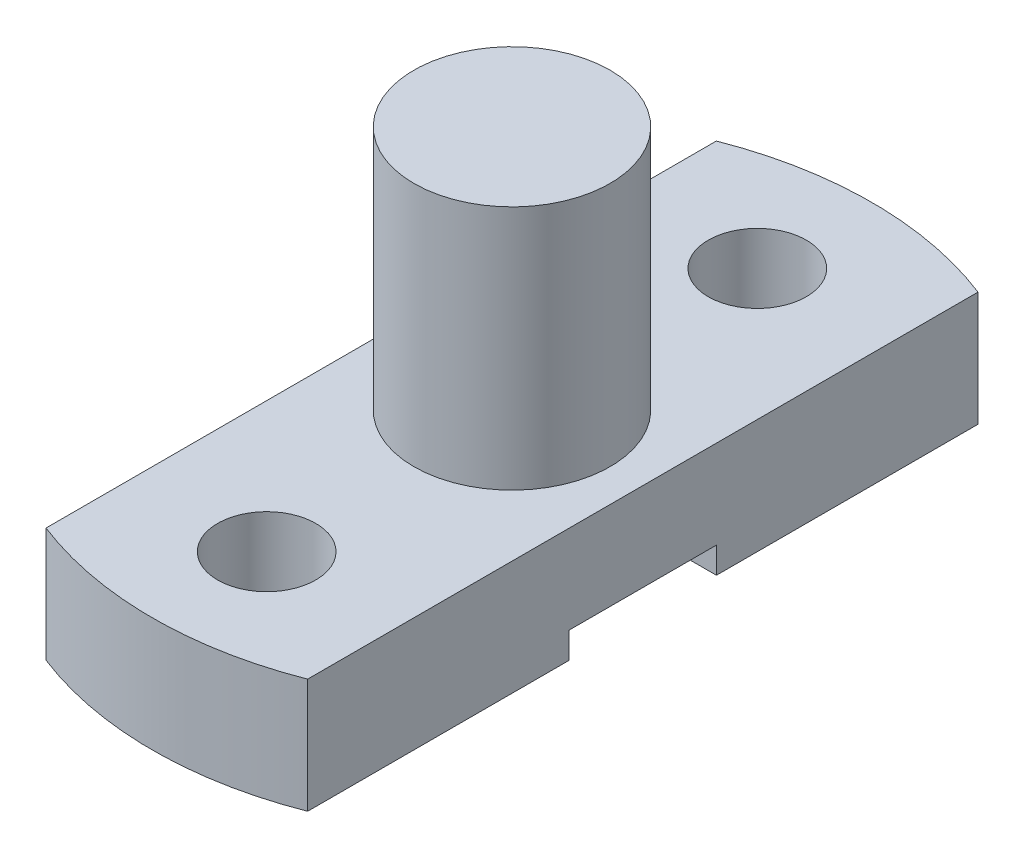
ISO-10303-21;
HEADER;
FILE_DESCRIPTION(('STEP AP214'),'2;1');
FILE_NAME('part.step','',(''),(''),'','','');
FILE_SCHEMA(('AUTOMOTIVE_DESIGN { 1 0 10303 214 1 1 1 1 }'));
ENDSEC;
DATA;
#1=APPLICATION_CONTEXT('core data for automotive mechanical design processes');
#2=APPLICATION_PROTOCOL_DEFINITION('international standard','automotive_design',2000,#1);
#3=PRODUCT_CONTEXT('',#1,'mechanical');
#4=PRODUCT('Part','Part','',(#3));
#5=PRODUCT_RELATED_PRODUCT_CATEGORY('part','',(#4));
#6=PRODUCT_DEFINITION_FORMATION('','',#4);
#7=PRODUCT_DEFINITION_CONTEXT('part definition',#1,'design');
#8=PRODUCT_DEFINITION('design','',#6,#7);
#9=PRODUCT_DEFINITION_SHAPE('','',#8);
#10=(LENGTH_UNIT() NAMED_UNIT(*) SI_UNIT(.MILLI.,.METRE.));
#11=(NAMED_UNIT(*) PLANE_ANGLE_UNIT() SI_UNIT($,.RADIAN.));
#12=(NAMED_UNIT(*) SI_UNIT($,.STERADIAN.) SOLID_ANGLE_UNIT());
#13=UNCERTAINTY_MEASURE_WITH_UNIT(LENGTH_MEASURE(1.E-05),#10,'distance_accuracy_value','');
#14=(GEOMETRIC_REPRESENTATION_CONTEXT(3) GLOBAL_UNCERTAINTY_ASSIGNED_CONTEXT((#13)) GLOBAL_UNIT_ASSIGNED_CONTEXT((#10,
#11,#12)) REPRESENTATION_CONTEXT('',''));
#15=CARTESIAN_POINT('',(0.,0.,0.));
#16=DIRECTION('',(0.,0.,1.));
#17=DIRECTION('',(1.,0.,0.));
#18=AXIS2_PLACEMENT_3D('',#15,#16,#17);
#19=CARTESIAN_POINT('',(0.,0.,0.));
#20=DIRECTION('',(0.,1.,0.));
#21=DIRECTION('',(0.,0.,1.));
#22=AXIS2_PLACEMENT_3D('',#19,#20,#21);
#23=PLANE('',#22);
#24=CARTESIAN_POINT('',(0.,0.,75.));
#25=DIRECTION('',(0.,1.,0.));
#26=DIRECTION('',(0.,0.,1.));
#27=AXIS2_PLACEMENT_3D('',#24,#25,#26);
#28=CIRCLE('',#27,15.);
#29=CARTESIAN_POINT('',(0.,0.,90.));
#30=VERTEX_POINT('',#29);
#31=EDGE_CURVE('E166',#30,#30,#28,.T.);
#32=ORIENTED_EDGE('',*,*,#31,.T.);
#33=EDGE_LOOP('',(#32));
#34=FACE_BOUND('',#33,.T.);
#35=DIRECTION('',(0.,0.,1.));
#36=VECTOR('',#35,1.);
#37=CARTESIAN_POINT('',(-40.,0.,0.));
#38=LINE('',#37,#36);
#39=CARTESIAN_POINT('',(-40.,0.,22.5));
#40=VERTEX_POINT('',#39);
#41=CARTESIAN_POINT('',(-40.,0.,102.469507659596));
#42=VERTEX_POINT('',#41);
#43=EDGE_CURVE('E169',#40,#42,#38,.T.);
#44=ORIENTED_EDGE('',*,*,#43,.F.);
#45=DIRECTION('',(1.,0.,0.));
#46=VECTOR('',#45,1.);
#47=CARTESIAN_POINT('',(-40.,0.,22.5));
#48=LINE('',#47,#46);
#49=CARTESIAN_POINT('',(40.,0.,22.5));
#50=VERTEX_POINT('',#49);
#51=EDGE_CURVE('E141',#40,#50,#48,.T.);
#52=ORIENTED_EDGE('',*,*,#51,.T.);
#53=DIRECTION('',(0.,0.,1.));
#54=VECTOR('',#53,1.);
#55=CARTESIAN_POINT('',(40.,0.,0.));
#56=LINE('',#55,#54);
#57=CARTESIAN_POINT('',(40.,0.,102.469507659596));
#58=VERTEX_POINT('',#57);
#59=EDGE_CURVE('E174',#50,#58,#56,.T.);
#60=ORIENTED_EDGE('',*,*,#59,.T.);
#61=CARTESIAN_POINT('',(0.,0.,0.));
#62=DIRECTION('',(0.,1.,0.));
#63=DIRECTION('',(0.,0.,1.));
#64=AXIS2_PLACEMENT_3D('',#61,#62,#63);
#65=CIRCLE('',#64,110.);
#66=EDGE_CURVE('E171',#42,#58,#65,.T.);
#67=ORIENTED_EDGE('',*,*,#66,.F.);
#68=EDGE_LOOP('',(#44,#52,#60,#67));
#69=FACE_BOUND('',#68,.T.);
#70=ADVANCED_FACE('F37',(#34,#69),#23,.F.);
#71=CARTESIAN_POINT('',(0.,110.,0.));
#72=DIRECTION('',(0.,-1.,0.));
#73=DIRECTION('',(0.,0.,-1.));
#74=AXIS2_PLACEMENT_3D('',#71,#72,#73);
#75=CYLINDRICAL_SURFACE('',#74,30.);
#76=CARTESIAN_POINT('',(0.,35.,0.));
#77=DIRECTION('',(0.,1.,0.));
#78=DIRECTION('',(0.,0.,1.));
#79=AXIS2_PLACEMENT_3D('',#76,#77,#78);
#80=CIRCLE('',#79,30.);
#81=CARTESIAN_POINT('',(0.,35.,30.));
#82=VERTEX_POINT('',#81);
#83=EDGE_CURVE('E147',#82,#82,#80,.T.);
#84=ORIENTED_EDGE('',*,*,#83,.T.);
#85=EDGE_LOOP('',(#84));
#86=FACE_BOUND('',#85,.T.);
#87=CARTESIAN_POINT('',(0.,110.,0.));
#88=DIRECTION('',(0.,1.,0.));
#89=DIRECTION('',(0.,0.,1.));
#90=AXIS2_PLACEMENT_3D('',#87,#88,#89);
#91=CIRCLE('',#90,30.);
#92=CARTESIAN_POINT('',(0.,110.,30.));
#93=VERTEX_POINT('',#92);
#94=EDGE_CURVE('E11',#93,#93,#91,.T.);
#95=ORIENTED_EDGE('',*,*,#94,.F.);
#96=EDGE_LOOP('',(#95));
#97=FACE_BOUND('',#96,.T.);
#98=ADVANCED_FACE('F39',(#86,#97),#75,.T.);
#99=CARTESIAN_POINT('',(0.,110.,0.));
#100=DIRECTION('',(0.,1.,0.));
#101=DIRECTION('',(0.,0.,1.));
#102=AXIS2_PLACEMENT_3D('',#99,#100,#101);
#103=PLANE('',#102);
#104=ORIENTED_EDGE('',*,*,#94,.T.);
#105=EDGE_LOOP('',(#104));
#106=FACE_BOUND('',#105,.T.);
#107=ADVANCED_FACE('F217',(#106),#103,.T.);
#108=CARTESIAN_POINT('',(-40.,35.,0.));
#109=DIRECTION('',(1.,0.,0.));
#110=DIRECTION('',(0.,0.,-1.));
#111=AXIS2_PLACEMENT_3D('',#108,#109,#110);
#112=PLANE('',#111);
#113=DIRECTION('',(0.,0.,1.));
#114=VECTOR('',#113,1.);
#115=CARTESIAN_POINT('',(-40.,8.,22.5));
#116=LINE('',#115,#114);
#117=CARTESIAN_POINT('',(-40.,8.,-22.5));
#118=VERTEX_POINT('',#117);
#119=CARTESIAN_POINT('',(-40.,8.,22.5));
#120=VERTEX_POINT('',#119);
#121=EDGE_CURVE('E122',#118,#120,#116,.T.);
#122=ORIENTED_EDGE('',*,*,#121,.T.);
#123=DIRECTION('',(0.,-1.,0.));
#124=VECTOR('',#123,1.);
#125=CARTESIAN_POINT('',(-40.,0.,22.5));
#126=LINE('',#125,#124);
#127=EDGE_CURVE('E127',#120,#40,#126,.T.);
#128=ORIENTED_EDGE('',*,*,#127,.T.);
#129=ORIENTED_EDGE('',*,*,#43,.T.);
#130=DIRECTION('',(0.,-1.,0.));
#131=VECTOR('',#130,1.);
#132=CARTESIAN_POINT('',(-40.,35.,102.469507659596));
#133=LINE('',#132,#131);
#134=CARTESIAN_POINT('',(-40.,35.,102.469507659596));
#135=VERTEX_POINT('',#134);
#136=EDGE_CURVE('E45',#135,#42,#133,.T.);
#137=ORIENTED_EDGE('',*,*,#136,.F.);
#138=DIRECTION('',(0.,0.,1.));
#139=VECTOR('',#138,1.);
#140=CARTESIAN_POINT('',(-40.,35.,0.));
#141=LINE('',#140,#139);
#142=CARTESIAN_POINT('',(-40.,35.,-102.469507659596));
#143=VERTEX_POINT('',#142);
#144=EDGE_CURVE('E156',#143,#135,#141,.T.);
#145=ORIENTED_EDGE('',*,*,#144,.F.);
#146=DIRECTION('',(0.,-1.,0.));
#147=VECTOR('',#146,1.);
#148=CARTESIAN_POINT('',(-40.,35.,-102.469507659596));
#149=LINE('',#148,#147);
#150=CARTESIAN_POINT('',(-40.,0.,-102.469507659596));
#151=VERTEX_POINT('',#150);
#152=EDGE_CURVE('E163',#143,#151,#149,.T.);
#153=ORIENTED_EDGE('',*,*,#152,.T.);
#154=CARTESIAN_POINT('',(-40.,0.,-22.5));
#155=VERTEX_POINT('',#154);
#156=EDGE_CURVE('E132',#151,#155,#38,.T.);
#157=ORIENTED_EDGE('',*,*,#156,.T.);
#158=DIRECTION('',(0.,1.,0.));
#159=VECTOR('',#158,1.);
#160=CARTESIAN_POINT('',(-40.,8.,-22.5));
#161=LINE('',#160,#159);
#162=EDGE_CURVE('E52',#155,#118,#161,.T.);
#163=ORIENTED_EDGE('',*,*,#162,.T.);
#164=EDGE_LOOP('',(#122,#128,#129,#137,#145,#153,#157,#163));
#165=FACE_BOUND('',#164,.T.);
#166=ADVANCED_FACE('F130',(#165),#112,.F.);
#167=CARTESIAN_POINT('',(0.,35.,0.));
#168=DIRECTION('',(0.,-1.,0.));
#169=DIRECTION('',(0.,0.,-1.));
#170=AXIS2_PLACEMENT_3D('',#167,#168,#169);
#171=CYLINDRICAL_SURFACE('',#170,110.);
#172=ORIENTED_EDGE('',*,*,#66,.T.);
#173=DIRECTION('',(0.,-1.,0.));
#174=VECTOR('',#173,1.);
#175=CARTESIAN_POINT('',(40.,35.,102.469507659596));
#176=LINE('',#175,#174);
#177=CARTESIAN_POINT('',(40.,35.,102.469507659596));
#178=VERTEX_POINT('',#177);
#179=EDGE_CURVE('E182',#178,#58,#176,.T.);
#180=ORIENTED_EDGE('',*,*,#179,.F.);
#181=CARTESIAN_POINT('',(0.,35.,0.));
#182=DIRECTION('',(0.,1.,0.));
#183=DIRECTION('',(0.,0.,1.));
#184=AXIS2_PLACEMENT_3D('',#181,#182,#183);
#185=CIRCLE('',#184,110.);
#186=EDGE_CURVE('E90',#135,#178,#185,.T.);
#187=ORIENTED_EDGE('',*,*,#186,.F.);
#188=ORIENTED_EDGE('',*,*,#136,.T.);
#189=EDGE_LOOP('',(#172,#180,#187,#188));
#190=FACE_BOUND('',#189,.T.);
#191=ADVANCED_FACE('F185',(#190),#171,.T.);
#192=CARTESIAN_POINT('',(40.,35.,0.));
#193=DIRECTION('',(1.,0.,0.));
#194=DIRECTION('',(0.,0.,-1.));
#195=AXIS2_PLACEMENT_3D('',#192,#193,#194);
#196=PLANE('',#195);
#197=DIRECTION('',(0.,-1.,0.));
#198=VECTOR('',#197,1.);
#199=CARTESIAN_POINT('',(40.,0.,22.5));
#200=LINE('',#199,#198);
#201=CARTESIAN_POINT('',(40.,8.,22.5));
#202=VERTEX_POINT('',#201);
#203=EDGE_CURVE('E133',#202,#50,#200,.T.);
#204=ORIENTED_EDGE('',*,*,#203,.F.);
#205=DIRECTION('',(0.,0.,1.));
#206=VECTOR('',#205,1.);
#207=CARTESIAN_POINT('',(40.,8.,22.5));
#208=LINE('',#207,#206);
#209=CARTESIAN_POINT('',(40.,8.,-22.5));
#210=VERTEX_POINT('',#209);
#211=EDGE_CURVE('E135',#210,#202,#208,.T.);
#212=ORIENTED_EDGE('',*,*,#211,.F.);
#213=DIRECTION('',(0.,1.,0.));
#214=VECTOR('',#213,1.);
#215=CARTESIAN_POINT('',(40.,8.,-22.5));
#216=LINE('',#215,#214);
#217=CARTESIAN_POINT('',(40.,0.,-22.5));
#218=VERTEX_POINT('',#217);
#219=EDGE_CURVE('E114',#218,#210,#216,.T.);
#220=ORIENTED_EDGE('',*,*,#219,.F.);
#221=CARTESIAN_POINT('',(40.,0.,-102.469507659596));
#222=VERTEX_POINT('',#221);
#223=EDGE_CURVE('E175',#222,#218,#56,.T.);
#224=ORIENTED_EDGE('',*,*,#223,.F.);
#225=DIRECTION('',(0.,-1.,0.));
#226=VECTOR('',#225,1.);
#227=CARTESIAN_POINT('',(40.,35.,-102.469507659596));
#228=LINE('',#227,#226);
#229=CARTESIAN_POINT('',(40.,35.,-102.469507659596));
#230=VERTEX_POINT('',#229);
#231=EDGE_CURVE('E180',#230,#222,#228,.T.);
#232=ORIENTED_EDGE('',*,*,#231,.F.);
#233=DIRECTION('',(0.,0.,1.));
#234=VECTOR('',#233,1.);
#235=CARTESIAN_POINT('',(40.,35.,0.));
#236=LINE('',#235,#234);
#237=EDGE_CURVE('E159',#230,#178,#236,.T.);
#238=ORIENTED_EDGE('',*,*,#237,.T.);
#239=ORIENTED_EDGE('',*,*,#179,.T.);
#240=ORIENTED_EDGE('',*,*,#59,.F.);
#241=EDGE_LOOP('',(#204,#212,#220,#224,#232,#238,#239,#240));
#242=FACE_BOUND('',#241,.T.);
#243=ADVANCED_FACE('F193',(#242),#196,.T.);
#244=CARTESIAN_POINT('',(0.,35.,75.));
#245=DIRECTION('',(0.,-1.,0.));
#246=DIRECTION('',(0.,0.,-1.));
#247=AXIS2_PLACEMENT_3D('',#244,#245,#246);
#248=CYLINDRICAL_SURFACE('',#247,15.);
#249=CARTESIAN_POINT('',(0.,35.,75.));
#250=DIRECTION('',(0.,1.,0.));
#251=DIRECTION('',(0.,0.,1.));
#252=AXIS2_PLACEMENT_3D('',#249,#250,#251);
#253=CIRCLE('',#252,15.);
#254=CARTESIAN_POINT('',(0.,35.,90.));
#255=VERTEX_POINT('',#254);
#256=EDGE_CURVE('E153',#255,#255,#253,.T.);
#257=ORIENTED_EDGE('',*,*,#256,.T.);
#258=EDGE_LOOP('',(#257));
#259=FACE_BOUND('',#258,.T.);
#260=ORIENTED_EDGE('',*,*,#31,.F.);
#261=EDGE_LOOP('',(#260));
#262=FACE_BOUND('',#261,.T.);
#263=ADVANCED_FACE('F225',(#259,#262),#248,.F.);
#264=CARTESIAN_POINT('',(0.,35.,-75.));
#265=DIRECTION('',(0.,-1.,0.));
#266=DIRECTION('',(0.,0.,-1.));
#267=AXIS2_PLACEMENT_3D('',#264,#265,#266);
#268=CYLINDRICAL_SURFACE('',#267,15.);
#269=CARTESIAN_POINT('',(0.,35.,-75.));
#270=DIRECTION('',(0.,1.,0.));
#271=DIRECTION('',(0.,0.,1.));
#272=AXIS2_PLACEMENT_3D('',#269,#270,#271);
#273=CIRCLE('',#272,15.);
#274=CARTESIAN_POINT('',(0.,35.,-60.));
#275=VERTEX_POINT('',#274);
#276=EDGE_CURVE('E150',#275,#275,#273,.T.);
#277=ORIENTED_EDGE('',*,*,#276,.T.);
#278=EDGE_LOOP('',(#277));
#279=FACE_BOUND('',#278,.T.);
#280=CARTESIAN_POINT('',(0.,0.,-75.));
#281=DIRECTION('',(0.,1.,0.));
#282=DIRECTION('',(0.,0.,1.));
#283=AXIS2_PLACEMENT_3D('',#280,#281,#282);
#284=CIRCLE('',#283,15.);
#285=CARTESIAN_POINT('',(0.,0.,-60.));
#286=VERTEX_POINT('',#285);
#287=EDGE_CURVE('E144',#286,#286,#284,.T.);
#288=ORIENTED_EDGE('',*,*,#287,.F.);
#289=EDGE_LOOP('',(#288));
#290=FACE_BOUND('',#289,.T.);
#291=ADVANCED_FACE('F207',(#279,#290),#268,.F.);
#292=CARTESIAN_POINT('',(0.,35.,0.));
#293=DIRECTION('',(0.,-1.,0.));
#294=DIRECTION('',(0.,0.,-1.));
#295=AXIS2_PLACEMENT_3D('',#292,#293,#294);
#296=CYLINDRICAL_SURFACE('',#295,110.);
#297=CARTESIAN_POINT('',(0.,0.,0.));
#298=DIRECTION('',(0.,1.,0.));
#299=DIRECTION('',(0.,0.,1.));
#300=AXIS2_PLACEMENT_3D('',#297,#298,#299);
#301=CIRCLE('',#300,110.);
#302=EDGE_CURVE('E82',#222,#151,#301,.T.);
#303=ORIENTED_EDGE('',*,*,#302,.T.);
#304=ORIENTED_EDGE('',*,*,#152,.F.);
#305=CARTESIAN_POINT('',(0.,35.,0.));
#306=DIRECTION('',(0.,1.,0.));
#307=DIRECTION('',(0.,0.,1.));
#308=AXIS2_PLACEMENT_3D('',#305,#306,#307);
#309=CIRCLE('',#308,110.);
#310=EDGE_CURVE('E61',#230,#143,#309,.T.);
#311=ORIENTED_EDGE('',*,*,#310,.F.);
#312=ORIENTED_EDGE('',*,*,#231,.T.);
#313=EDGE_LOOP('',(#303,#304,#311,#312));
#314=FACE_BOUND('',#313,.T.);
#315=ADVANCED_FACE('F198',(#314),#296,.T.);
#316=CARTESIAN_POINT('',(0.,35.,0.));
#317=DIRECTION('',(0.,1.,0.));
#318=DIRECTION('',(0.,0.,1.));
#319=AXIS2_PLACEMENT_3D('',#316,#317,#318);
#320=PLANE('',#319);
#321=ORIENTED_EDGE('',*,*,#83,.F.);
#322=EDGE_LOOP('',(#321));
#323=FACE_BOUND('',#322,.T.);
#324=ORIENTED_EDGE('',*,*,#276,.F.);
#325=EDGE_LOOP('',(#324));
#326=FACE_BOUND('',#325,.T.);
#327=ORIENTED_EDGE('',*,*,#256,.F.);
#328=EDGE_LOOP('',(#327));
#329=FACE_BOUND('',#328,.T.);
#330=ORIENTED_EDGE('',*,*,#144,.T.);
#331=ORIENTED_EDGE('',*,*,#186,.T.);
#332=ORIENTED_EDGE('',*,*,#237,.F.);
#333=ORIENTED_EDGE('',*,*,#310,.T.);
#334=EDGE_LOOP('',(#330,#331,#332,#333));
#335=FACE_BOUND('',#334,.T.);
#336=ADVANCED_FACE('F195',(#323,#326,#329,#335),#320,.T.);
#337=ORIENTED_EDGE('',*,*,#287,.T.);
#338=EDGE_LOOP('',(#337));
#339=FACE_BOUND('',#338,.T.);
#340=ORIENTED_EDGE('',*,*,#223,.T.);
#341=DIRECTION('',(1.,0.,0.));
#342=VECTOR('',#341,1.);
#343=CARTESIAN_POINT('',(-40.,0.,-22.5));
#344=LINE('',#343,#342);
#345=EDGE_CURVE('E119',#155,#218,#344,.T.);
#346=ORIENTED_EDGE('',*,*,#345,.F.);
#347=ORIENTED_EDGE('',*,*,#156,.F.);
#348=ORIENTED_EDGE('',*,*,#302,.F.);
#349=EDGE_LOOP('',(#340,#346,#347,#348));
#350=FACE_BOUND('',#349,.T.);
#351=ADVANCED_FACE('F197',(#339,#350),#23,.F.);
#352=CARTESIAN_POINT('',(-40.,0.,22.5));
#353=DIRECTION('',(0.,0.,1.));
#354=DIRECTION('',(0.,-1.,0.));
#355=AXIS2_PLACEMENT_3D('',#352,#353,#354);
#356=PLANE('',#355);
#357=ORIENTED_EDGE('',*,*,#203,.T.);
#358=ORIENTED_EDGE('',*,*,#51,.F.);
#359=ORIENTED_EDGE('',*,*,#127,.F.);
#360=DIRECTION('',(1.,0.,0.));
#361=VECTOR('',#360,1.);
#362=CARTESIAN_POINT('',(-40.,8.,22.5));
#363=LINE('',#362,#361);
#364=EDGE_CURVE('E118',#120,#202,#363,.T.);
#365=ORIENTED_EDGE('',*,*,#364,.T.);
#366=EDGE_LOOP('',(#357,#358,#359,#365));
#367=FACE_BOUND('',#366,.T.);
#368=ADVANCED_FACE('F205',(#367),#356,.F.);
#369=CARTESIAN_POINT('',(-40.,8.,22.5));
#370=DIRECTION('',(0.,1.,0.));
#371=DIRECTION('',(0.,0.,1.));
#372=AXIS2_PLACEMENT_3D('',#369,#370,#371);
#373=PLANE('',#372);
#374=ORIENTED_EDGE('',*,*,#211,.T.);
#375=ORIENTED_EDGE('',*,*,#364,.F.);
#376=ORIENTED_EDGE('',*,*,#121,.F.);
#377=DIRECTION('',(1.,0.,0.));
#378=VECTOR('',#377,1.);
#379=CARTESIAN_POINT('',(-40.,8.,-22.5));
#380=LINE('',#379,#378);
#381=EDGE_CURVE('E110',#118,#210,#380,.T.);
#382=ORIENTED_EDGE('',*,*,#381,.T.);
#383=EDGE_LOOP('',(#374,#375,#376,#382));
#384=FACE_BOUND('',#383,.T.);
#385=ADVANCED_FACE('F123',(#384),#373,.F.);
#386=CARTESIAN_POINT('',(-40.,8.,-22.5));
#387=DIRECTION('',(0.,0.,-1.));
#388=DIRECTION('',(-1.,0.,0.));
#389=AXIS2_PLACEMENT_3D('',#386,#387,#388);
#390=PLANE('',#389);
#391=ORIENTED_EDGE('',*,*,#219,.T.);
#392=ORIENTED_EDGE('',*,*,#381,.F.);
#393=ORIENTED_EDGE('',*,*,#162,.F.);
#394=ORIENTED_EDGE('',*,*,#345,.T.);
#395=EDGE_LOOP('',(#391,#392,#393,#394));
#396=FACE_BOUND('',#395,.T.);
#397=ADVANCED_FACE('F112',(#396),#390,.F.);
#398=CLOSED_SHELL('',(#70,#98,#107,#166,#191,#243,#263,#291,#315,#336,#351,#368,#385,#397));
#399=MANIFOLD_SOLID_BREP('B2',#398);
#400=ADVANCED_BREP_SHAPE_REPRESENTATION('',(#18,#399),#14);
#401=SHAPE_DEFINITION_REPRESENTATION(#9,#400);
ENDSEC;
END-ISO-10303-21;
